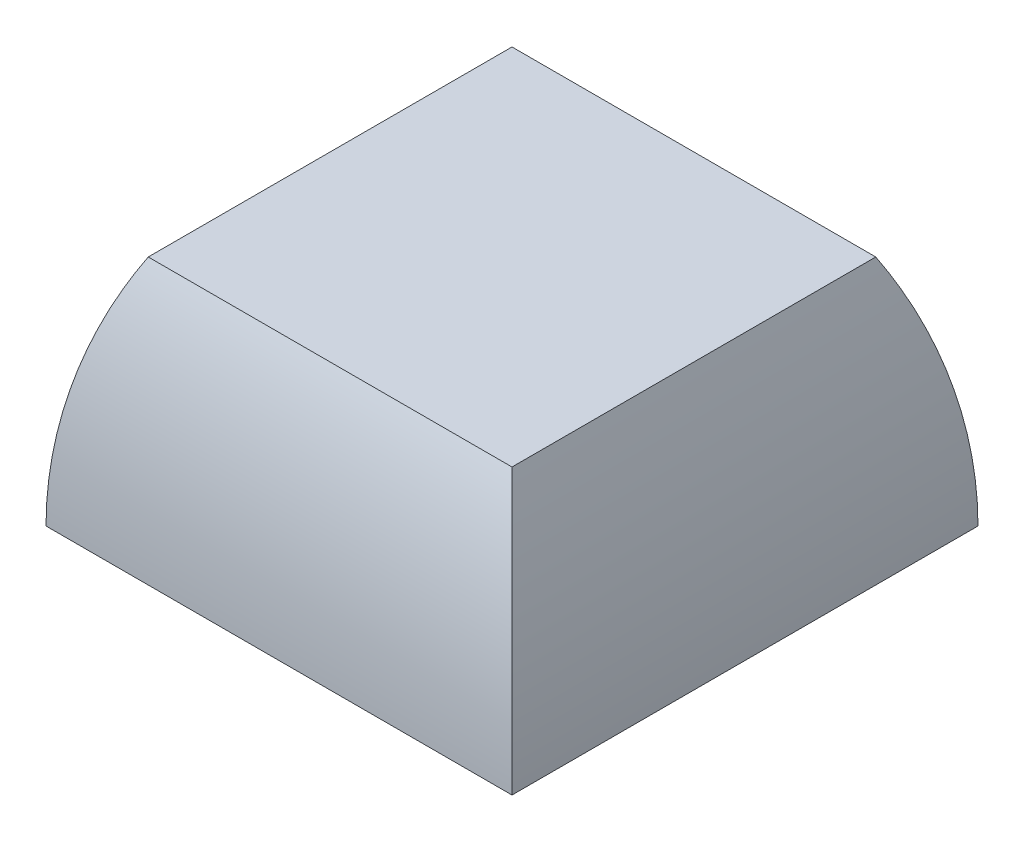
ISO-10303-21;
HEADER;
FILE_DESCRIPTION(('STEP AP214'),'2;1');
FILE_NAME('part.step','',(''),(''),'','','');
FILE_SCHEMA(('AUTOMOTIVE_DESIGN { 1 0 10303 214 1 1 1 1 }'));
ENDSEC;
DATA;
#1=APPLICATION_CONTEXT('core data for automotive mechanical design processes');
#2=APPLICATION_PROTOCOL_DEFINITION('international standard','automotive_design',2000,#1);
#3=PRODUCT_CONTEXT('',#1,'mechanical');
#4=PRODUCT('Part','Part','',(#3));
#5=PRODUCT_RELATED_PRODUCT_CATEGORY('part','',(#4));
#6=PRODUCT_DEFINITION_FORMATION('','',#4);
#7=PRODUCT_DEFINITION_CONTEXT('part definition',#1,'design');
#8=PRODUCT_DEFINITION('design','',#6,#7);
#9=PRODUCT_DEFINITION_SHAPE('','',#8);
#10=(LENGTH_UNIT() NAMED_UNIT(*) SI_UNIT(.MILLI.,.METRE.));
#11=(NAMED_UNIT(*) PLANE_ANGLE_UNIT() SI_UNIT($,.RADIAN.));
#12=(NAMED_UNIT(*) SI_UNIT($,.STERADIAN.) SOLID_ANGLE_UNIT());
#13=UNCERTAINTY_MEASURE_WITH_UNIT(LENGTH_MEASURE(1.E-05),#10,'distance_accuracy_value','');
#14=(GEOMETRIC_REPRESENTATION_CONTEXT(3) GLOBAL_UNCERTAINTY_ASSIGNED_CONTEXT((#13)) GLOBAL_UNIT_ASSIGNED_CONTEXT((#10,
#11,#12)) REPRESENTATION_CONTEXT('',''));
#15=CARTESIAN_POINT('',(0.,0.,0.));
#16=DIRECTION('',(0.,0.,1.));
#17=DIRECTION('',(1.,0.,0.));
#18=AXIS2_PLACEMENT_3D('',#15,#16,#17);
#19=CARTESIAN_POINT('',(0.,7.5,0.));
#20=DIRECTION('',(0.,1.,0.));
#21=DIRECTION('',(0.,0.,1.));
#22=AXIS2_PLACEMENT_3D('',#19,#20,#21);
#23=PLANE('',#22);
#24=DIRECTION('',(0.,0.,1.));
#25=VECTOR('',#24,1.);
#26=CARTESIAN_POINT('',(-5.8546856234985,7.5,-7.5));
#27=LINE('',#26,#25);
#28=CARTESIAN_POINT('',(-5.85468562349849,7.5,-5.8546856234985));
#29=VERTEX_POINT('',#28);
#30=CARTESIAN_POINT('',(-5.85468562349849,7.5,5.8546856234985));
#31=VERTEX_POINT('',#30);
#32=EDGE_CURVE('E242',#29,#31,#27,.T.);
#33=ORIENTED_EDGE('',*,*,#32,.T.);
#34=DIRECTION('',(1.,0.,0.));
#35=VECTOR('',#34,1.);
#36=CARTESIAN_POINT('',(-7.5,7.5,5.8546856234985));
#37=LINE('',#36,#35);
#38=CARTESIAN_POINT('',(5.8546856234985,7.49999999999937,5.85468562349928));
#39=VERTEX_POINT('',#38);
#40=EDGE_CURVE('E226',#31,#39,#37,.T.);
#41=ORIENTED_EDGE('',*,*,#40,.T.);
#42=DIRECTION('',(0.,0.,1.));
#43=VECTOR('',#42,1.);
#44=CARTESIAN_POINT('',(5.8546856234985,7.5,-7.5));
#45=LINE('',#44,#43);
#46=CARTESIAN_POINT('',(5.8546856234985,7.5,-5.85468562349854));
#47=VERTEX_POINT('',#46);
#48=EDGE_CURVE('E109',#39,#47,#45,.F.);
#49=ORIENTED_EDGE('',*,*,#48,.T.);
#50=DIRECTION('',(1.,0.,0.));
#51=VECTOR('',#50,1.);
#52=CARTESIAN_POINT('',(-7.5,7.5,-5.8546856234985));
#53=LINE('',#52,#51);
#54=EDGE_CURVE('E225',#47,#29,#53,.F.);
#55=ORIENTED_EDGE('',*,*,#54,.T.);
#56=EDGE_LOOP('',(#33,#41,#49,#55));
#57=FACE_BOUND('',#56,.T.);
#58=ADVANCED_FACE('F80',(#57),#23,.T.);
#59=CARTESIAN_POINT('',(0.,0.,-7.5));
#60=DIRECTION('',(0.,0.,1.));
#61=DIRECTION('',(0.,1.,0.));
#62=AXIS2_PLACEMENT_3D('',#59,#60,#61);
#63=ELLIPSE('',#62,12.,7.5);
#64=DIRECTION('',(0.,0.,1.));
#65=VECTOR('',#64,1.);
#66=SURFACE_OF_LINEAR_EXTRUSION('',#63,#65);
#67=DIRECTION('',(0.,0.,-1.));
#68=VECTOR('',#67,1.);
#69=CARTESIAN_POINT('',(-7.5,0.,0.));
#70=LINE('',#69,#68);
#71=CARTESIAN_POINT('',(-7.5,0.,7.5));
#72=VERTEX_POINT('',#71);
#73=CARTESIAN_POINT('',(-7.5,0.,-7.5));
#74=VERTEX_POINT('',#73);
#75=EDGE_CURVE('E94',#72,#74,#70,.T.);
#76=ORIENTED_EDGE('',*,*,#75,.F.);
#77=CARTESIAN_POINT('',(-7.5,0.,7.5));
#78=CARTESIAN_POINT('',(-7.50000581593978,0.374600366246169,7.50000581593976));
#79=CARTESIAN_POINT('',(-7.48903718679777,0.749220043230019,7.48903718679775));
#80=CARTESIAN_POINT('',(-7.44518385391939,1.49594081226902,7.44518385391942));
#81=CARTESIAN_POINT('',(-7.41229577772299,1.86804150786073,7.41229577772304));
#82=CARTESIAN_POINT('',(-7.32560572872962,2.59887820210439,7.32560572872967));
#83=CARTESIAN_POINT('',(-7.27228237630433,2.95772777310214,7.27228237630435));
#84=CARTESIAN_POINT('',(-7.14478061601195,3.66795214473992,7.14478061601194));
#85=CARTESIAN_POINT('',(-7.07060351714082,4.01932741305556,7.07060351714083));
#86=CARTESIAN_POINT('',(-6.91829284595293,4.64329397365243,6.91829284595294));
#87=CARTESIAN_POINT('',(-6.84385526934174,4.91770088794566,6.84385526934175));
#88=CARTESIAN_POINT('',(-6.68174716265329,5.4586511617768,6.6817471626533));
#89=CARTESIAN_POINT('',(-6.59407474200055,5.72519339134407,6.59407474200056));
#90=CARTESIAN_POINT('',(-6.40535484636438,6.24969560767173,6.40535484636438));
#91=CARTESIAN_POINT('',(-6.30426654356309,6.50762626226706,6.30426654356309));
#92=CARTESIAN_POINT('',(-6.08913580104028,7.01247582782092,6.08913580104028));
#93=CARTESIAN_POINT('',(-5.97509199747877,7.25939357562113,5.97509199747877));
#94=CARTESIAN_POINT('',(-5.85468562349882,7.49999999999934,5.85468562349883));
#95=B_SPLINE_CURVE_WITH_KNOTS('',3,(#77,#78,#79,#80,#81,#82,#83,#84,#85,#86,#87,#88,#89,#90,#91,
#92,#93,#94),.UNSPECIFIED.,.F.,.F.,(4,2,2,2,2,2,2,2,4),(0.,1.12351481336076,2.24720252724033,
3.34603863793685,4.44480578975315,5.32586627410039,6.20705273577978,7.09098513933269,
7.97501068181441),.UNSPECIFIED.);
#96=EDGE_CURVE('E218',#72,#31,#95,.T.);
#97=ORIENTED_EDGE('',*,*,#96,.T.);
#98=ORIENTED_EDGE('',*,*,#32,.F.);
#99=CARTESIAN_POINT('',(-5.8546856234985,7.49999999999997,-5.85468562349854));
#100=CARTESIAN_POINT('',(-5.99371826130266,7.22218087043968,-5.99371826130267));
#101=CARTESIAN_POINT('',(-6.12425791477211,6.93595754554716,-6.12425791477212));
#102=CARTESIAN_POINT('',(-6.36798076861697,6.34924362602741,-6.36798076861697));
#103=CARTESIAN_POINT('',(-6.48117124489866,6.04875908190176,-6.48117124489867));
#104=CARTESIAN_POINT('',(-6.68991489305702,5.43590783745997,-6.68991489305703));
#105=CARTESIAN_POINT('',(-6.7854727602603,5.12354432715138,-6.78547276026031));
#106=CARTESIAN_POINT('',(-6.95880639123888,4.489086111478,-6.95880639123888));
#107=CARTESIAN_POINT('',(-7.03658095177133,4.16699074931113,-7.03658095177134));
#108=CARTESIAN_POINT('',(-7.17036319265366,3.53346231131283,-7.17036319265366));
#109=CARTESIAN_POINT('',(-7.227344066872,3.22243864638629,-7.22734406687201));
#110=CARTESIAN_POINT('',(-7.32528560744749,2.59526554802846,-7.3252856074475));
#111=CARTESIAN_POINT('',(-7.36624012515977,2.27911419566823,-7.36624012515978));
#112=CARTESIAN_POINT('',(-7.4327621037431,1.63665548430864,-7.43276210374311));
#113=CARTESIAN_POINT('',(-7.45798022588094,1.3102758292514,-7.45798022588095));
#114=CARTESIAN_POINT('',(-7.49159706782222,0.655927407587399,-7.49159706782223));
#115=CARTESIAN_POINT('',(-7.5000029511581,0.32795937751055,-7.50000295115811));
#116=CARTESIAN_POINT('',(-7.5,0.,-7.5));
#117=B_SPLINE_CURVE_WITH_KNOTS('',3,(#99,#100,#101,#102,#103,#104,#105,#106,#107,#108,#109,#110,
#111,#112,#113,#114,#115,#116),.UNSPECIFIED.,.F.,.F.,(4,2,2,2,2,2,2,2,4),(0.,1.02064704819316,
2.04086487880574,3.060810645843,4.08082540339753,5.04386377583932,6.00727126456085,
6.99136874170992,7.97504681502981),.UNSPECIFIED.);
#118=EDGE_CURVE('E259',#29,#74,#117,.T.);
#119=ORIENTED_EDGE('',*,*,#118,.T.);
#120=EDGE_LOOP('',(#76,#97,#98,#119));
#121=FACE_BOUND('',#120,.T.);
#122=ADVANCED_FACE('F229',(#121),#66,.T.);
#123=CARTESIAN_POINT('',(0.,0.,-7.5));
#124=DIRECTION('',(0.,0.,1.));
#125=DIRECTION('',(0.,1.,0.));
#126=AXIS2_PLACEMENT_3D('',#123,#124,#125);
#127=ELLIPSE('',#126,12.,7.5);
#128=DIRECTION('',(0.,0.,1.));
#129=VECTOR('',#128,1.);
#130=SURFACE_OF_LINEAR_EXTRUSION('',#127,#129);
#131=ORIENTED_EDGE('',*,*,#48,.F.);
#132=CARTESIAN_POINT('',(5.8546856234985,7.49999999999937,5.85468562349928));
#133=CARTESIAN_POINT('',(5.99371826130285,7.22218087043905,5.99371826130313));
#134=CARTESIAN_POINT('',(6.12425791477237,6.9359575455465,6.12425791477245));
#135=CARTESIAN_POINT('',(6.36798076861727,6.34924362602672,6.3679807686172));
#136=CARTESIAN_POINT('',(6.48117124489893,6.04875908190106,6.48117124489891));
#137=CARTESIAN_POINT('',(6.68991489305724,5.43590783745926,6.68991489305727));
#138=CARTESIAN_POINT('',(6.78547276026051,5.12354432715066,6.78547276026052));
#139=CARTESIAN_POINT('',(6.95880639123906,4.48908611147727,6.95880639123906));
#140=CARTESIAN_POINT('',(7.0365809517715,4.1669907493104,7.0365809517715));
#141=CARTESIAN_POINT('',(7.17036319265379,3.53346231131215,7.1703631926538));
#142=CARTESIAN_POINT('',(7.22734406687211,3.22243864638566,7.22734406687211));
#143=CARTESIAN_POINT('',(7.32528560744756,2.59526554802795,7.32528560744757));
#144=CARTESIAN_POINT('',(7.36624012515983,2.27911419566778,7.36624012515983));
#145=CARTESIAN_POINT('',(7.43276210374313,1.63665548430831,7.43276210374314));
#146=CARTESIAN_POINT('',(7.45798022588096,1.31027582925114,7.45798022588097));
#147=CARTESIAN_POINT('',(7.49159706782222,0.655927407587265,7.49159706782223));
#148=CARTESIAN_POINT('',(7.5000029511581,0.327959377510482,7.5000029511581));
#149=CARTESIAN_POINT('',(7.5,0.,7.5));
#150=B_SPLINE_CURVE_WITH_KNOTS('',3,(#132,#133,#134,#135,#136,#137,#138,#139,#140,#141,#142,
#143,#144,#145,#146,#147,#148,#149),.UNSPECIFIED.,.F.,.F.,(4,2,2,2,2,2,2,2,4),(0.,
1.02064704819315,2.04086487880573,3.06081064584299,4.08082540339751,5.04386377583912,
6.00727126456046,6.99136874170933,7.97504681502903),.UNSPECIFIED.);
#151=CARTESIAN_POINT('',(7.5,0.,7.5));
#152=VERTEX_POINT('',#151);
#153=EDGE_CURVE('E162',#39,#152,#150,.T.);
#154=ORIENTED_EDGE('',*,*,#153,.T.);
#155=DIRECTION('',(0.,0.,-1.));
#156=VECTOR('',#155,1.);
#157=CARTESIAN_POINT('',(7.5,0.,0.));
#158=LINE('',#157,#156);
#159=CARTESIAN_POINT('',(7.5,0.,-7.5));
#160=VERTEX_POINT('',#159);
#161=EDGE_CURVE('E247',#152,#160,#158,.T.);
#162=ORIENTED_EDGE('',*,*,#161,.T.);
#163=CARTESIAN_POINT('',(7.5,0.,-7.5));
#164=CARTESIAN_POINT('',(7.50000582795523,0.374567038102582,-7.5000058279552));
#165=CARTESIAN_POINT('',(7.48903914104715,0.749153489712632,-7.48903914104713));
#166=CARTESIAN_POINT('',(7.44518968579594,1.49587477418793,-7.44518968579596));
#167=CARTESIAN_POINT('',(7.41229965674866,1.86800875358059,-7.41229965674871));
#168=CARTESIAN_POINT('',(7.32560192482437,2.59891032192792,-7.32560192482442));
#169=CARTESIAN_POINT('',(7.27227292136666,2.95779150515511,-7.27227292136668));
#170=CARTESIAN_POINT('',(7.14476736936425,3.6680148696187,-7.14476736936424));
#171=CARTESIAN_POINT('',(7.07059584049188,4.01935884419891,-7.07059584049188));
#172=CARTESIAN_POINT('',(6.91885877493805,4.64097556330466,-6.91885877493806));
#173=CARTESIAN_POINT('',(6.84509796095141,4.91311777184241,-6.84509796095142));
#174=CARTESIAN_POINT('',(6.68456276451167,5.449681004249,-6.68456276451167));
#175=CARTESIAN_POINT('',(6.59778652733984,5.71410092125258,-6.59778652733985));
#176=CARTESIAN_POINT('',(6.40950540951246,6.23891323977219,-6.40950540951247));
#177=CARTESIAN_POINT('',(6.30774108419805,6.49911986438974,-6.30774108419805));
#178=CARTESIAN_POINT('',(6.0910372436362,7.00835798018116,-6.0910372436362));
#179=CARTESIAN_POINT('',(5.97609597722274,7.25738797989004,-5.97609597722275));
#180=CARTESIAN_POINT('',(5.85468562349851,7.49999999999997,-5.85468562349851));
#181=B_SPLINE_CURVE_WITH_KNOTS('',3,(#163,#164,#165,#166,#167,#168,#169,#170,#171,#172,#173,
#174,#175,#176,#177,#178,#179,#180),.UNSPECIFIED.,.F.,.F.,(4,2,2,2,2,2,2,2,4),(0.,
1.12341514109128,2.24720252653995,3.34613637797387,4.44480579086702,5.3185116104918,
6.19234205309857,7.08361669011961,7.97500991180455),.UNSPECIFIED.);
#182=EDGE_CURVE('E12',#160,#47,#181,.T.);
#183=ORIENTED_EDGE('',*,*,#182,.T.);
#184=EDGE_LOOP('',(#131,#154,#162,#183));
#185=FACE_BOUND('',#184,.T.);
#186=ADVANCED_FACE('F233',(#185),#130,.T.);
#187=CARTESIAN_POINT('',(0.,0.,0.));
#188=DIRECTION('',(0.,1.,0.));
#189=DIRECTION('',(0.,0.,1.));
#190=AXIS2_PLACEMENT_3D('',#187,#188,#189);
#191=PLANE('',#190);
#192=DIRECTION('',(1.,0.,0.));
#193=VECTOR('',#192,1.);
#194=CARTESIAN_POINT('',(0.,0.,-6.5));
#195=LINE('',#194,#193);
#196=CARTESIAN_POINT('',(-6.5,0.,-6.5));
#197=VERTEX_POINT('',#196);
#198=CARTESIAN_POINT('',(6.5,0.,-6.5));
#199=VERTEX_POINT('',#198);
#200=EDGE_CURVE('E178',#197,#199,#195,.T.);
#201=ORIENTED_EDGE('',*,*,#200,.F.);
#202=DIRECTION('',(0.,0.,-1.));
#203=VECTOR('',#202,1.);
#204=CARTESIAN_POINT('',(-6.5,0.,0.));
#205=LINE('',#204,#203);
#206=CARTESIAN_POINT('',(-6.5,0.,6.5));
#207=VERTEX_POINT('',#206);
#208=EDGE_CURVE('E101',#207,#197,#205,.T.);
#209=ORIENTED_EDGE('',*,*,#208,.F.);
#210=DIRECTION('',(1.,0.,0.));
#211=VECTOR('',#210,1.);
#212=CARTESIAN_POINT('',(0.,0.,6.5));
#213=LINE('',#212,#211);
#214=CARTESIAN_POINT('',(6.49999999999999,0.,6.5));
#215=VERTEX_POINT('',#214);
#216=EDGE_CURVE('E160',#207,#215,#213,.T.);
#217=ORIENTED_EDGE('',*,*,#216,.T.);
#218=DIRECTION('',(0.,0.,-1.));
#219=VECTOR('',#218,1.);
#220=CARTESIAN_POINT('',(6.5,0.,0.));
#221=LINE('',#220,#219);
#222=EDGE_CURVE('E189',#215,#199,#221,.T.);
#223=ORIENTED_EDGE('',*,*,#222,.T.);
#224=EDGE_LOOP('',(#201,#209,#217,#223));
#225=FACE_BOUND('',#224,.T.);
#226=DIRECTION('',(1.,0.,0.));
#227=VECTOR('',#226,1.);
#228=CARTESIAN_POINT('',(0.,0.,7.5));
#229=LINE('',#228,#227);
#230=EDGE_CURVE('E245',#72,#152,#229,.T.);
#231=ORIENTED_EDGE('',*,*,#230,.F.);
#232=ORIENTED_EDGE('',*,*,#75,.T.);
#233=DIRECTION('',(1.,0.,0.));
#234=VECTOR('',#233,1.);
#235=CARTESIAN_POINT('',(0.,0.,-7.5));
#236=LINE('',#235,#234);
#237=EDGE_CURVE('E250',#74,#160,#236,.T.);
#238=ORIENTED_EDGE('',*,*,#237,.T.);
#239=ORIENTED_EDGE('',*,*,#161,.F.);
#240=EDGE_LOOP('',(#231,#232,#238,#239));
#241=FACE_BOUND('',#240,.T.);
#242=ADVANCED_FACE('F82',(#225,#241),#191,.F.);
#243=CARTESIAN_POINT('',(-7.5,0.,0.));
#244=DIRECTION('',(1.,0.,0.));
#245=DIRECTION('',(0.,-1.,0.));
#246=AXIS2_PLACEMENT_3D('',#243,#244,#245);
#247=ELLIPSE('',#246,12.,7.5);
#248=DIRECTION('',(1.,0.,0.));
#249=VECTOR('',#248,1.);
#250=SURFACE_OF_LINEAR_EXTRUSION('',#247,#249);
#251=ORIENTED_EDGE('',*,*,#54,.F.);
#252=ORIENTED_EDGE('',*,*,#182,.F.);
#253=ORIENTED_EDGE('',*,*,#237,.F.);
#254=ORIENTED_EDGE('',*,*,#118,.F.);
#255=EDGE_LOOP('',(#251,#252,#253,#254));
#256=FACE_BOUND('',#255,.T.);
#257=ADVANCED_FACE('F210',(#256),#250,.T.);
#258=CARTESIAN_POINT('',(-7.5,0.,0.));
#259=DIRECTION('',(1.,0.,0.));
#260=DIRECTION('',(0.,-1.,0.));
#261=AXIS2_PLACEMENT_3D('',#258,#259,#260);
#262=ELLIPSE('',#261,12.,7.5);
#263=DIRECTION('',(1.,0.,0.));
#264=VECTOR('',#263,1.);
#265=SURFACE_OF_LINEAR_EXTRUSION('',#262,#264);
#266=ORIENTED_EDGE('',*,*,#230,.T.);
#267=ORIENTED_EDGE('',*,*,#153,.F.);
#268=ORIENTED_EDGE('',*,*,#40,.F.);
#269=ORIENTED_EDGE('',*,*,#96,.F.);
#270=EDGE_LOOP('',(#266,#267,#268,#269));
#271=FACE_BOUND('',#270,.T.);
#272=ADVANCED_FACE('F206',(#271),#265,.T.);
#273=CARTESIAN_POINT('',(-6.5,5.,0.));
#274=DIRECTION('',(-1.,0.,0.));
#275=DIRECTION('',(0.,0.,1.));
#276=AXIS2_PLACEMENT_3D('',#273,#274,#275);
#277=PLANE('',#276);
#278=ORIENTED_EDGE('',*,*,#208,.T.);
#279=DIRECTION('',(0.,-1.,0.));
#280=VECTOR('',#279,1.);
#281=CARTESIAN_POINT('',(-6.5,5.,-6.5));
#282=LINE('',#281,#280);
#283=CARTESIAN_POINT('',(-6.5,5.,-6.5));
#284=VERTEX_POINT('',#283);
#285=EDGE_CURVE('E174',#284,#197,#282,.T.);
#286=ORIENTED_EDGE('',*,*,#285,.F.);
#287=DIRECTION('',(0.,0.,-1.));
#288=VECTOR('',#287,1.);
#289=CARTESIAN_POINT('',(-6.5,5.,0.));
#290=LINE('',#289,#288);
#291=CARTESIAN_POINT('',(-6.5,5.,6.5));
#292=VERTEX_POINT('',#291);
#293=EDGE_CURVE('E169',#292,#284,#290,.T.);
#294=ORIENTED_EDGE('',*,*,#293,.F.);
#295=DIRECTION('',(0.,-1.,0.));
#296=VECTOR('',#295,1.);
#297=CARTESIAN_POINT('',(-6.5,5.,6.5));
#298=LINE('',#297,#296);
#299=EDGE_CURVE('E153',#292,#207,#298,.T.);
#300=ORIENTED_EDGE('',*,*,#299,.T.);
#301=EDGE_LOOP('',(#278,#286,#294,#300));
#302=FACE_BOUND('',#301,.T.);
#303=ADVANCED_FACE('F173',(#302),#277,.F.);
#304=CARTESIAN_POINT('',(0.,5.,6.5));
#305=DIRECTION('',(0.,0.,-1.));
#306=DIRECTION('',(-1.,0.,0.));
#307=AXIS2_PLACEMENT_3D('',#304,#305,#306);
#308=PLANE('',#307);
#309=ORIENTED_EDGE('',*,*,#216,.F.);
#310=ORIENTED_EDGE('',*,*,#299,.F.);
#311=DIRECTION('',(1.,0.,0.));
#312=VECTOR('',#311,1.);
#313=CARTESIAN_POINT('',(0.,5.,6.5));
#314=LINE('',#313,#312);
#315=CARTESIAN_POINT('',(6.49999999999999,5.,6.5));
#316=VERTEX_POINT('',#315);
#317=EDGE_CURVE('E157',#292,#316,#314,.T.);
#318=ORIENTED_EDGE('',*,*,#317,.T.);
#319=DIRECTION('',(0.,-1.,0.));
#320=VECTOR('',#319,1.);
#321=CARTESIAN_POINT('',(6.49999999999999,5.,6.5));
#322=LINE('',#321,#320);
#323=EDGE_CURVE('E163',#316,#215,#322,.T.);
#324=ORIENTED_EDGE('',*,*,#323,.T.);
#325=EDGE_LOOP('',(#309,#310,#318,#324));
#326=FACE_BOUND('',#325,.T.);
#327=ADVANCED_FACE('F155',(#326),#308,.T.);
#328=CARTESIAN_POINT('',(6.5,5.,0.));
#329=DIRECTION('',(-1.,0.,0.));
#330=DIRECTION('',(0.,0.,1.));
#331=AXIS2_PLACEMENT_3D('',#328,#329,#330);
#332=PLANE('',#331);
#333=ORIENTED_EDGE('',*,*,#222,.F.);
#334=ORIENTED_EDGE('',*,*,#323,.F.);
#335=DIRECTION('',(0.,0.,-1.));
#336=VECTOR('',#335,1.);
#337=CARTESIAN_POINT('',(6.5,5.,0.));
#338=LINE('',#337,#336);
#339=CARTESIAN_POINT('',(6.5,5.,-6.5));
#340=VERTEX_POINT('',#339);
#341=EDGE_CURVE('E171',#316,#340,#338,.T.);
#342=ORIENTED_EDGE('',*,*,#341,.T.);
#343=DIRECTION('',(0.,-1.,0.));
#344=VECTOR('',#343,1.);
#345=CARTESIAN_POINT('',(6.5,5.,-6.5));
#346=LINE('',#345,#344);
#347=EDGE_CURVE('E195',#340,#199,#346,.T.);
#348=ORIENTED_EDGE('',*,*,#347,.T.);
#349=EDGE_LOOP('',(#333,#334,#342,#348));
#350=FACE_BOUND('',#349,.T.);
#351=ADVANCED_FACE('F321',(#350),#332,.T.);
#352=CARTESIAN_POINT('',(0.,5.,0.));
#353=DIRECTION('',(0.,-1.,0.));
#354=DIRECTION('',(0.,0.,-1.));
#355=AXIS2_PLACEMENT_3D('',#352,#353,#354);
#356=CYLINDRICAL_SURFACE('',#355,2.);
#357=CARTESIAN_POINT('',(0.,5.,0.));
#358=DIRECTION('',(0.,1.,0.));
#359=DIRECTION('',(0.,0.,1.));
#360=AXIS2_PLACEMENT_3D('',#357,#358,#359);
#361=CIRCLE('',#360,2.);
#362=CARTESIAN_POINT('',(0.,5.,2.));
#363=VERTEX_POINT('',#362);
#364=EDGE_CURVE('E175',#363,#363,#361,.T.);
#365=ORIENTED_EDGE('',*,*,#364,.F.);
#366=EDGE_LOOP('',(#365));
#367=FACE_BOUND('',#366,.T.);
#368=CARTESIAN_POINT('',(0.,0.,0.));
#369=DIRECTION('',(0.,1.,0.));
#370=DIRECTION('',(0.,0.,1.));
#371=AXIS2_PLACEMENT_3D('',#368,#369,#370);
#372=CIRCLE('',#371,2.);
#373=CARTESIAN_POINT('',(0.,0.,2.));
#374=VERTEX_POINT('',#373);
#375=EDGE_CURVE('E184',#374,#374,#372,.T.);
#376=ORIENTED_EDGE('',*,*,#375,.T.);
#377=EDGE_LOOP('',(#376));
#378=FACE_BOUND('',#377,.T.);
#379=ADVANCED_FACE('F212',(#367,#378),#356,.T.);
#380=CARTESIAN_POINT('',(0.,5.,-6.5));
#381=DIRECTION('',(0.,0.,-1.));
#382=DIRECTION('',(-1.,0.,0.));
#383=AXIS2_PLACEMENT_3D('',#380,#381,#382);
#384=PLANE('',#383);
#385=ORIENTED_EDGE('',*,*,#200,.T.);
#386=ORIENTED_EDGE('',*,*,#347,.F.);
#387=DIRECTION('',(1.,0.,0.));
#388=VECTOR('',#387,1.);
#389=CARTESIAN_POINT('',(0.,5.,-6.5));
#390=LINE('',#389,#388);
#391=EDGE_CURVE('E182',#284,#340,#390,.T.);
#392=ORIENTED_EDGE('',*,*,#391,.F.);
#393=ORIENTED_EDGE('',*,*,#285,.T.);
#394=EDGE_LOOP('',(#385,#386,#392,#393));
#395=FACE_BOUND('',#394,.T.);
#396=ADVANCED_FACE('F339',(#395),#384,.F.);
#397=CARTESIAN_POINT('',(0.,5.,0.));
#398=DIRECTION('',(0.,1.,0.));
#399=DIRECTION('',(0.,0.,1.));
#400=AXIS2_PLACEMENT_3D('',#397,#398,#399);
#401=PLANE('',#400);
#402=ORIENTED_EDGE('',*,*,#364,.T.);
#403=EDGE_LOOP('',(#402));
#404=FACE_BOUND('',#403,.T.);
#405=ORIENTED_EDGE('',*,*,#293,.T.);
#406=ORIENTED_EDGE('',*,*,#391,.T.);
#407=ORIENTED_EDGE('',*,*,#341,.F.);
#408=ORIENTED_EDGE('',*,*,#317,.F.);
#409=EDGE_LOOP('',(#405,#406,#407,#408));
#410=FACE_BOUND('',#409,.T.);
#411=ADVANCED_FACE('F167',(#404,#410),#401,.F.);
#412=ORIENTED_EDGE('',*,*,#375,.F.);
#413=EDGE_LOOP('',(#412));
#414=FACE_BOUND('',#413,.T.);
#415=ADVANCED_FACE('F273',(#414),#191,.F.);
#416=CLOSED_SHELL('',(#58,#122,#186,#242,#257,#272,#303,#327,#351,#379,#396,#411,#415));
#417=MANIFOLD_SOLID_BREP('B2',#416);
#418=ADVANCED_BREP_SHAPE_REPRESENTATION('',(#18,#417),#14);
#419=SHAPE_DEFINITION_REPRESENTATION(#9,#418);
ENDSEC;
END-ISO-10303-21;
